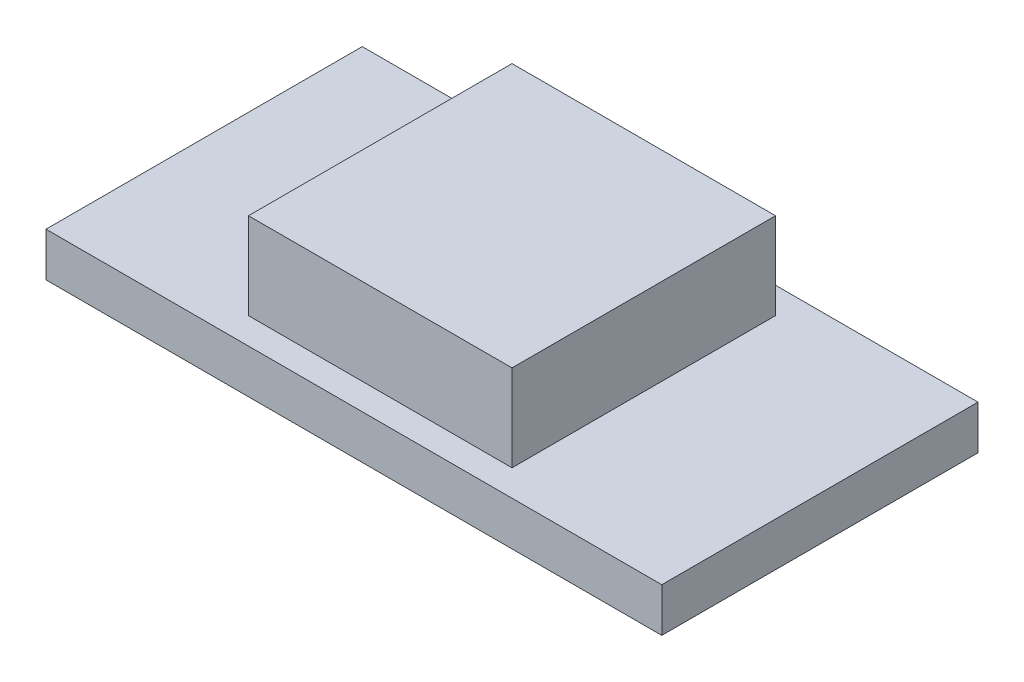
ISO-10303-21;
HEADER;
FILE_DESCRIPTION(('STEP AP214'),'2;1');
FILE_NAME('part.step','',(''),(''),'','','');
FILE_SCHEMA(('AUTOMOTIVE_DESIGN { 1 0 10303 214 1 1 1 1 }'));
ENDSEC;
DATA;
#1=APPLICATION_CONTEXT('core data for automotive mechanical design processes');
#2=APPLICATION_PROTOCOL_DEFINITION('international standard','automotive_design',2000,#1);
#3=PRODUCT_CONTEXT('',#1,'mechanical');
#4=PRODUCT('Part','Part','',(#3));
#5=PRODUCT_RELATED_PRODUCT_CATEGORY('part','',(#4));
#6=PRODUCT_DEFINITION_FORMATION('','',#4);
#7=PRODUCT_DEFINITION_CONTEXT('part definition',#1,'design');
#8=PRODUCT_DEFINITION('design','',#6,#7);
#9=PRODUCT_DEFINITION_SHAPE('','',#8);
#10=(LENGTH_UNIT() NAMED_UNIT(*) SI_UNIT(.MILLI.,.METRE.));
#11=(NAMED_UNIT(*) PLANE_ANGLE_UNIT() SI_UNIT($,.RADIAN.));
#12=(NAMED_UNIT(*) SI_UNIT($,.STERADIAN.) SOLID_ANGLE_UNIT());
#13=UNCERTAINTY_MEASURE_WITH_UNIT(LENGTH_MEASURE(1.E-05),#10,'distance_accuracy_value','');
#14=(GEOMETRIC_REPRESENTATION_CONTEXT(3) GLOBAL_UNCERTAINTY_ASSIGNED_CONTEXT((#13)) GLOBAL_UNIT_ASSIGNED_CONTEXT((#10,
#11,#12)) REPRESENTATION_CONTEXT('',''));
#15=CARTESIAN_POINT('',(0.,0.,0.));
#16=DIRECTION('',(0.,0.,1.));
#17=DIRECTION('',(1.,0.,0.));
#18=AXIS2_PLACEMENT_3D('',#15,#16,#17);
#19=CARTESIAN_POINT('',(0.,5.,0.));
#20=DIRECTION('',(0.,1.,0.));
#21=DIRECTION('',(0.,0.,1.));
#22=AXIS2_PLACEMENT_3D('',#19,#20,#21);
#23=PLANE('',#22);
#24=DIRECTION('',(0.,0.,-1.));
#25=VECTOR('',#24,1.);
#26=CARTESIAN_POINT('',(35.05,5.,-18.));
#27=LINE('',#26,#25);
#28=CARTESIAN_POINT('',(35.05,5.,18.));
#29=VERTEX_POINT('',#28);
#30=CARTESIAN_POINT('',(35.05,5.,-18.));
#31=VERTEX_POINT('',#30);
#32=EDGE_CURVE('E140',#29,#31,#27,.T.);
#33=ORIENTED_EDGE('',*,*,#32,.T.);
#34=DIRECTION('',(-1.,0.,0.));
#35=VECTOR('',#34,1.);
#36=CARTESIAN_POINT('',(-35.05,5.,-18.));
#37=LINE('',#36,#35);
#38=CARTESIAN_POINT('',(-35.05,5.,-18.));
#39=VERTEX_POINT('',#38);
#40=EDGE_CURVE('E85',#31,#39,#37,.T.);
#41=ORIENTED_EDGE('',*,*,#40,.T.);
#42=DIRECTION('',(0.,0.,1.));
#43=VECTOR('',#42,1.);
#44=CARTESIAN_POINT('',(-35.05,5.,-18.));
#45=LINE('',#44,#43);
#46=CARTESIAN_POINT('',(-35.05,5.,18.));
#47=VERTEX_POINT('',#46);
#48=EDGE_CURVE('E143',#39,#47,#45,.T.);
#49=ORIENTED_EDGE('',*,*,#48,.T.);
#50=DIRECTION('',(1.,0.,0.));
#51=VECTOR('',#50,1.);
#52=CARTESIAN_POINT('',(-35.05,5.,18.));
#53=LINE('',#52,#51);
#54=EDGE_CURVE('E57',#47,#29,#53,.T.);
#55=ORIENTED_EDGE('',*,*,#54,.T.);
#56=EDGE_LOOP('',(#33,#41,#49,#55));
#57=FACE_BOUND('',#56,.T.);
#58=DIRECTION('',(-1.,0.,0.));
#59=VECTOR('',#58,1.);
#60=CARTESIAN_POINT('',(-15.,5.,-15.));
#61=LINE('',#60,#59);
#62=CARTESIAN_POINT('',(15.,5.,-15.));
#63=VERTEX_POINT('',#62);
#64=CARTESIAN_POINT('',(-15.,5.,-15.));
#65=VERTEX_POINT('',#64);
#66=EDGE_CURVE('E263',#63,#65,#61,.T.);
#67=ORIENTED_EDGE('',*,*,#66,.F.);
#68=DIRECTION('',(0.,0.,-1.));
#69=VECTOR('',#68,1.);
#70=CARTESIAN_POINT('',(15.,5.,-15.));
#71=LINE('',#70,#69);
#72=CARTESIAN_POINT('',(15.,5.,15.));
#73=VERTEX_POINT('',#72);
#74=EDGE_CURVE('E130',#73,#63,#71,.T.);
#75=ORIENTED_EDGE('',*,*,#74,.F.);
#76=DIRECTION('',(1.,0.,0.));
#77=VECTOR('',#76,1.);
#78=CARTESIAN_POINT('',(-15.,5.,15.));
#79=LINE('',#78,#77);
#80=CARTESIAN_POINT('',(-15.,5.,15.));
#81=VERTEX_POINT('',#80);
#82=EDGE_CURVE('E126',#81,#73,#79,.T.);
#83=ORIENTED_EDGE('',*,*,#82,.F.);
#84=DIRECTION('',(0.,0.,1.));
#85=VECTOR('',#84,1.);
#86=CARTESIAN_POINT('',(-15.,5.,-15.));
#87=LINE('',#86,#85);
#88=EDGE_CURVE('E260',#65,#81,#87,.T.);
#89=ORIENTED_EDGE('',*,*,#88,.F.);
#90=EDGE_LOOP('',(#67,#75,#83,#89));
#91=FACE_BOUND('',#90,.T.);
#92=ADVANCED_FACE('F33',(#57,#91),#23,.T.);
#93=CARTESIAN_POINT('',(35.05,5.,-18.));
#94=DIRECTION('',(-1.,0.,0.));
#95=DIRECTION('',(0.,0.,1.));
#96=AXIS2_PLACEMENT_3D('',#93,#94,#95);
#97=PLANE('',#96);
#98=DIRECTION('',(0.,0.,-1.));
#99=VECTOR('',#98,1.);
#100=CARTESIAN_POINT('',(35.05,0.,-18.));
#101=LINE('',#100,#99);
#102=CARTESIAN_POINT('',(35.05,0.,18.));
#103=VERTEX_POINT('',#102);
#104=CARTESIAN_POINT('',(35.05,0.,-18.));
#105=VERTEX_POINT('',#104);
#106=EDGE_CURVE('E132',#103,#105,#101,.T.);
#107=ORIENTED_EDGE('',*,*,#106,.T.);
#108=DIRECTION('',(0.,-1.,0.));
#109=VECTOR('',#108,1.);
#110=CARTESIAN_POINT('',(35.05,5.,-18.));
#111=LINE('',#110,#109);
#112=EDGE_CURVE('E11',#31,#105,#111,.T.);
#113=ORIENTED_EDGE('',*,*,#112,.F.);
#114=ORIENTED_EDGE('',*,*,#32,.F.);
#115=DIRECTION('',(0.,-1.,0.));
#116=VECTOR('',#115,1.);
#117=CARTESIAN_POINT('',(35.05,5.,18.));
#118=LINE('',#117,#116);
#119=EDGE_CURVE('E145',#29,#103,#118,.T.);
#120=ORIENTED_EDGE('',*,*,#119,.T.);
#121=EDGE_LOOP('',(#107,#113,#114,#120));
#122=FACE_BOUND('',#121,.T.);
#123=ADVANCED_FACE('F35',(#122),#97,.F.);
#124=CARTESIAN_POINT('',(-35.05,5.,-18.));
#125=DIRECTION('',(0.,0.,1.));
#126=DIRECTION('',(1.,0.,0.));
#127=AXIS2_PLACEMENT_3D('',#124,#125,#126);
#128=PLANE('',#127);
#129=DIRECTION('',(-1.,0.,0.));
#130=VECTOR('',#129,1.);
#131=CARTESIAN_POINT('',(-35.05,0.,-18.));
#132=LINE('',#131,#130);
#133=CARTESIAN_POINT('',(-35.05,0.,-18.));
#134=VERTEX_POINT('',#133);
#135=EDGE_CURVE('E135',#105,#134,#132,.T.);
#136=ORIENTED_EDGE('',*,*,#135,.T.);
#137=DIRECTION('',(0.,-1.,0.));
#138=VECTOR('',#137,1.);
#139=CARTESIAN_POINT('',(-35.05,5.,-18.));
#140=LINE('',#139,#138);
#141=EDGE_CURVE('E41',#39,#134,#140,.T.);
#142=ORIENTED_EDGE('',*,*,#141,.F.);
#143=ORIENTED_EDGE('',*,*,#40,.F.);
#144=ORIENTED_EDGE('',*,*,#112,.T.);
#145=EDGE_LOOP('',(#136,#142,#143,#144));
#146=FACE_BOUND('',#145,.T.);
#147=ADVANCED_FACE('F173',(#146),#128,.F.);
#148=CARTESIAN_POINT('',(-35.05,5.,-18.));
#149=DIRECTION('',(1.,0.,0.));
#150=DIRECTION('',(0.,0.,-1.));
#151=AXIS2_PLACEMENT_3D('',#148,#149,#150);
#152=PLANE('',#151);
#153=DIRECTION('',(0.,0.,1.));
#154=VECTOR('',#153,1.);
#155=CARTESIAN_POINT('',(-35.05,0.,-18.));
#156=LINE('',#155,#154);
#157=CARTESIAN_POINT('',(-35.05,0.,18.));
#158=VERTEX_POINT('',#157);
#159=EDGE_CURVE('E148',#134,#158,#156,.T.);
#160=ORIENTED_EDGE('',*,*,#159,.T.);
#161=DIRECTION('',(0.,-1.,0.));
#162=VECTOR('',#161,1.);
#163=CARTESIAN_POINT('',(-35.05,5.,18.));
#164=LINE('',#163,#162);
#165=EDGE_CURVE('E152',#47,#158,#164,.T.);
#166=ORIENTED_EDGE('',*,*,#165,.F.);
#167=ORIENTED_EDGE('',*,*,#48,.F.);
#168=ORIENTED_EDGE('',*,*,#141,.T.);
#169=EDGE_LOOP('',(#160,#166,#167,#168));
#170=FACE_BOUND('',#169,.T.);
#171=ADVANCED_FACE('F157',(#170),#152,.F.);
#172=CARTESIAN_POINT('',(-35.05,5.,18.));
#173=DIRECTION('',(0.,0.,-1.));
#174=DIRECTION('',(-1.,0.,0.));
#175=AXIS2_PLACEMENT_3D('',#172,#173,#174);
#176=PLANE('',#175);
#177=DIRECTION('',(1.,0.,0.));
#178=VECTOR('',#177,1.);
#179=CARTESIAN_POINT('',(-35.05,0.,18.));
#180=LINE('',#179,#178);
#181=EDGE_CURVE('E78',#158,#103,#180,.T.);
#182=ORIENTED_EDGE('',*,*,#181,.T.);
#183=ORIENTED_EDGE('',*,*,#119,.F.);
#184=ORIENTED_EDGE('',*,*,#54,.F.);
#185=ORIENTED_EDGE('',*,*,#165,.T.);
#186=EDGE_LOOP('',(#182,#183,#184,#185));
#187=FACE_BOUND('',#186,.T.);
#188=ADVANCED_FACE('F165',(#187),#176,.F.);
#189=CARTESIAN_POINT('',(0.,0.,0.));
#190=DIRECTION('',(0.,1.,0.));
#191=DIRECTION('',(0.,0.,1.));
#192=AXIS2_PLACEMENT_3D('',#189,#190,#191);
#193=PLANE('',#192);
#194=ORIENTED_EDGE('',*,*,#106,.F.);
#195=ORIENTED_EDGE('',*,*,#181,.F.);
#196=ORIENTED_EDGE('',*,*,#159,.F.);
#197=ORIENTED_EDGE('',*,*,#135,.F.);
#198=EDGE_LOOP('',(#194,#195,#196,#197));
#199=FACE_BOUND('',#198,.T.);
#200=ADVANCED_FACE('F161',(#199),#193,.F.);
#201=CARTESIAN_POINT('',(15.,14.85,-15.));
#202=DIRECTION('',(-1.,0.,0.));
#203=DIRECTION('',(0.,0.,1.));
#204=AXIS2_PLACEMENT_3D('',#201,#202,#203);
#205=PLANE('',#204);
#206=ORIENTED_EDGE('',*,*,#74,.T.);
#207=DIRECTION('',(0.,-1.,0.));
#208=VECTOR('',#207,1.);
#209=CARTESIAN_POINT('',(15.,14.85,-15.));
#210=LINE('',#209,#208);
#211=CARTESIAN_POINT('',(15.,14.85,-15.));
#212=VERTEX_POINT('',#211);
#213=EDGE_CURVE('E111',#212,#63,#210,.T.);
#214=ORIENTED_EDGE('',*,*,#213,.F.);
#215=DIRECTION('',(0.,0.,-1.));
#216=VECTOR('',#215,1.);
#217=CARTESIAN_POINT('',(15.,14.85,-15.));
#218=LINE('',#217,#216);
#219=CARTESIAN_POINT('',(15.,14.85,15.));
#220=VERTEX_POINT('',#219);
#221=EDGE_CURVE('E118',#220,#212,#218,.T.);
#222=ORIENTED_EDGE('',*,*,#221,.F.);
#223=DIRECTION('',(0.,-1.,0.));
#224=VECTOR('',#223,1.);
#225=CARTESIAN_POINT('',(15.,14.85,15.));
#226=LINE('',#225,#224);
#227=EDGE_CURVE('E258',#220,#73,#226,.T.);
#228=ORIENTED_EDGE('',*,*,#227,.T.);
#229=EDGE_LOOP('',(#206,#214,#222,#228));
#230=FACE_BOUND('',#229,.T.);
#231=ADVANCED_FACE('F128',(#230),#205,.F.);
#232=CARTESIAN_POINT('',(-15.,14.85,-15.));
#233=DIRECTION('',(0.,0.,1.));
#234=DIRECTION('',(1.,0.,0.));
#235=AXIS2_PLACEMENT_3D('',#232,#233,#234);
#236=PLANE('',#235);
#237=ORIENTED_EDGE('',*,*,#66,.T.);
#238=DIRECTION('',(0.,-1.,0.));
#239=VECTOR('',#238,1.);
#240=CARTESIAN_POINT('',(-15.,14.85,-15.));
#241=LINE('',#240,#239);
#242=CARTESIAN_POINT('',(-15.,14.85,-15.));
#243=VERTEX_POINT('',#242);
#244=EDGE_CURVE('E114',#243,#65,#241,.T.);
#245=ORIENTED_EDGE('',*,*,#244,.F.);
#246=DIRECTION('',(-1.,0.,0.));
#247=VECTOR('',#246,1.);
#248=CARTESIAN_POINT('',(-15.,14.85,-15.));
#249=LINE('',#248,#247);
#250=EDGE_CURVE('E107',#212,#243,#249,.T.);
#251=ORIENTED_EDGE('',*,*,#250,.F.);
#252=ORIENTED_EDGE('',*,*,#213,.T.);
#253=EDGE_LOOP('',(#237,#245,#251,#252));
#254=FACE_BOUND('',#253,.T.);
#255=ADVANCED_FACE('F109',(#254),#236,.F.);
#256=CARTESIAN_POINT('',(-15.,14.85,-15.));
#257=DIRECTION('',(1.,0.,0.));
#258=DIRECTION('',(0.,0.,-1.));
#259=AXIS2_PLACEMENT_3D('',#256,#257,#258);
#260=PLANE('',#259);
#261=ORIENTED_EDGE('',*,*,#88,.T.);
#262=DIRECTION('',(0.,-1.,0.));
#263=VECTOR('',#262,1.);
#264=CARTESIAN_POINT('',(-15.,14.85,15.));
#265=LINE('',#264,#263);
#266=CARTESIAN_POINT('',(-15.,14.85,15.));
#267=VERTEX_POINT('',#266);
#268=EDGE_CURVE('E48',#267,#81,#265,.T.);
#269=ORIENTED_EDGE('',*,*,#268,.F.);
#270=DIRECTION('',(0.,0.,1.));
#271=VECTOR('',#270,1.);
#272=CARTESIAN_POINT('',(-15.,14.85,-15.));
#273=LINE('',#272,#271);
#274=EDGE_CURVE('E117',#243,#267,#273,.T.);
#275=ORIENTED_EDGE('',*,*,#274,.F.);
#276=ORIENTED_EDGE('',*,*,#244,.T.);
#277=EDGE_LOOP('',(#261,#269,#275,#276));
#278=FACE_BOUND('',#277,.T.);
#279=ADVANCED_FACE('F186',(#278),#260,.F.);
#280=CARTESIAN_POINT('',(-15.,14.85,15.));
#281=DIRECTION('',(0.,0.,-1.));
#282=DIRECTION('',(-1.,0.,0.));
#283=AXIS2_PLACEMENT_3D('',#280,#281,#282);
#284=PLANE('',#283);
#285=ORIENTED_EDGE('',*,*,#82,.T.);
#286=ORIENTED_EDGE('',*,*,#227,.F.);
#287=DIRECTION('',(1.,0.,0.));
#288=VECTOR('',#287,1.);
#289=CARTESIAN_POINT('',(-15.,14.85,15.));
#290=LINE('',#289,#288);
#291=EDGE_CURVE('E122',#267,#220,#290,.T.);
#292=ORIENTED_EDGE('',*,*,#291,.F.);
#293=ORIENTED_EDGE('',*,*,#268,.T.);
#294=EDGE_LOOP('',(#285,#286,#292,#293));
#295=FACE_BOUND('',#294,.T.);
#296=ADVANCED_FACE('F189',(#295),#284,.F.);
#297=CARTESIAN_POINT('',(0.,14.85,0.));
#298=DIRECTION('',(0.,1.,0.));
#299=DIRECTION('',(0.,0.,1.));
#300=AXIS2_PLACEMENT_3D('',#297,#298,#299);
#301=PLANE('',#300);
#302=ORIENTED_EDGE('',*,*,#221,.T.);
#303=ORIENTED_EDGE('',*,*,#250,.T.);
#304=ORIENTED_EDGE('',*,*,#274,.T.);
#305=ORIENTED_EDGE('',*,*,#291,.T.);
#306=EDGE_LOOP('',(#302,#303,#304,#305));
#307=FACE_BOUND('',#306,.T.);
#308=ADVANCED_FACE('F121',(#307),#301,.T.);
#309=CLOSED_SHELL('',(#92,#123,#147,#171,#188,#200,#231,#255,#279,#296,#308));
#310=MANIFOLD_SOLID_BREP('B2',#309);
#311=ADVANCED_BREP_SHAPE_REPRESENTATION('',(#18,#310),#14);
#312=SHAPE_DEFINITION_REPRESENTATION(#9,#311);
ENDSEC;
END-ISO-10303-21;
